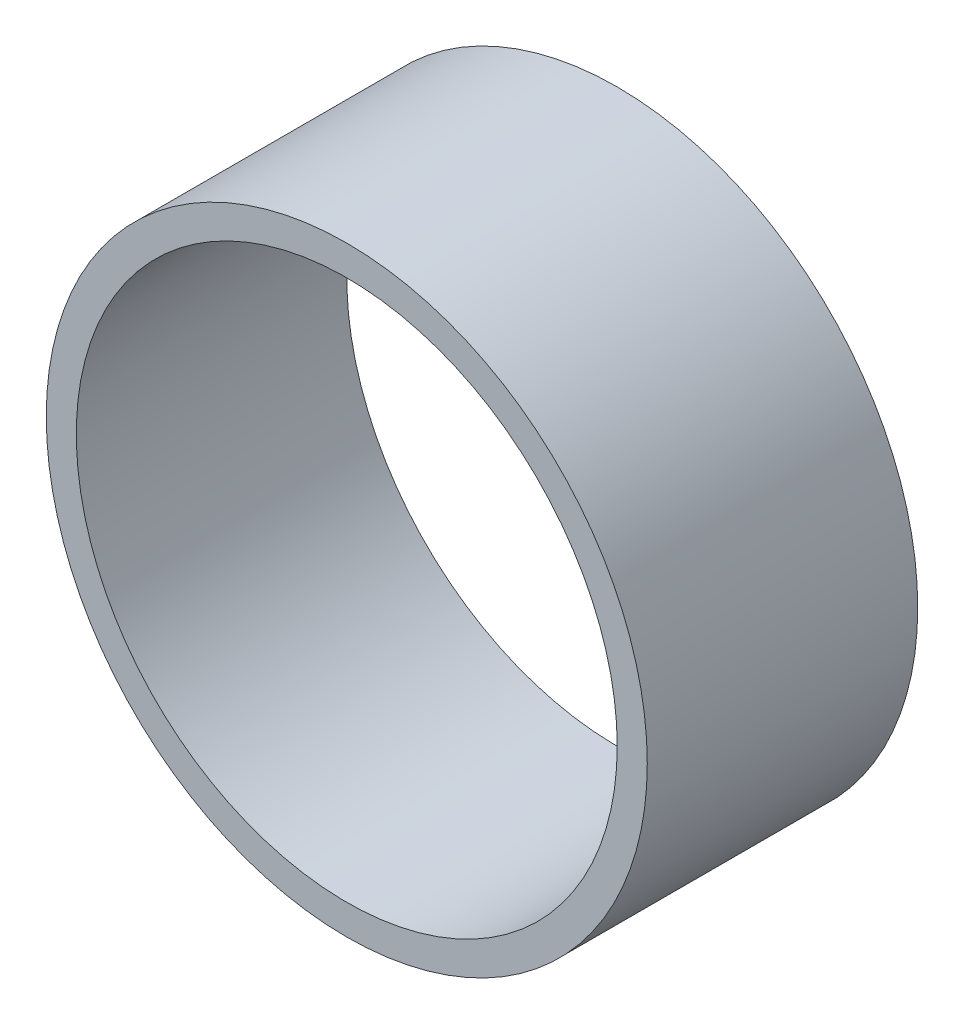
ISO-10303-21;
HEADER;
FILE_DESCRIPTION(('STEP AP214'),'2;1');
FILE_NAME('part.step','',(''),(''),'','','');
FILE_SCHEMA(('AUTOMOTIVE_DESIGN { 1 0 10303 214 1 1 1 1 }'));
ENDSEC;
DATA;
#1=APPLICATION_CONTEXT('core data for automotive mechanical design processes');
#2=APPLICATION_PROTOCOL_DEFINITION('international standard','automotive_design',2000,#1);
#3=PRODUCT_CONTEXT('',#1,'mechanical');
#4=PRODUCT('Part','Part','',(#3));
#5=PRODUCT_RELATED_PRODUCT_CATEGORY('part','',(#4));
#6=PRODUCT_DEFINITION_FORMATION('','',#4);
#7=PRODUCT_DEFINITION_CONTEXT('part definition',#1,'design');
#8=PRODUCT_DEFINITION('design','',#6,#7);
#9=PRODUCT_DEFINITION_SHAPE('','',#8);
#10=(LENGTH_UNIT() NAMED_UNIT(*) SI_UNIT(.MILLI.,.METRE.));
#11=(NAMED_UNIT(*) PLANE_ANGLE_UNIT() SI_UNIT($,.RADIAN.));
#12=(NAMED_UNIT(*) SI_UNIT($,.STERADIAN.) SOLID_ANGLE_UNIT());
#13=UNCERTAINTY_MEASURE_WITH_UNIT(LENGTH_MEASURE(1.E-05),#10,'distance_accuracy_value','');
#14=(GEOMETRIC_REPRESENTATION_CONTEXT(3) GLOBAL_UNCERTAINTY_ASSIGNED_CONTEXT((#13)) GLOBAL_UNIT_ASSIGNED_CONTEXT((#10,
#11,#12)) REPRESENTATION_CONTEXT('',''));
#15=CARTESIAN_POINT('',(0.,0.,0.));
#16=DIRECTION('',(0.,0.,1.));
#17=DIRECTION('',(1.,0.,0.));
#18=AXIS2_PLACEMENT_3D('',#15,#16,#17);
#19=CARTESIAN_POINT('',(0.,0.,9.));
#20=DIRECTION('',(0.,0.,-1.));
#21=DIRECTION('',(-1.,0.,0.));
#22=AXIS2_PLACEMENT_3D('',#19,#20,#21);
#23=CYLINDRICAL_SURFACE('',#22,10.);
#24=CARTESIAN_POINT('',(0.,0.,9.));
#25=DIRECTION('',(0.,0.,1.));
#26=DIRECTION('',(1.,0.,0.));
#27=AXIS2_PLACEMENT_3D('',#24,#25,#26);
#28=CIRCLE('',#27,10.);
#29=CARTESIAN_POINT('',(10.,0.,9.));
#30=VERTEX_POINT('',#29);
#31=EDGE_CURVE('E10',#30,#30,#28,.T.);
#32=ORIENTED_EDGE('',*,*,#31,.F.);
#33=EDGE_LOOP('',(#32));
#34=FACE_BOUND('',#33,.T.);
#35=CARTESIAN_POINT('',(0.,0.,0.));
#36=DIRECTION('',(0.,0.,1.));
#37=DIRECTION('',(1.,0.,0.));
#38=AXIS2_PLACEMENT_3D('',#35,#36,#37);
#39=CIRCLE('',#38,10.);
#40=CARTESIAN_POINT('',(10.,0.,0.));
#41=VERTEX_POINT('',#40);
#42=EDGE_CURVE('E37',#41,#41,#39,.T.);
#43=ORIENTED_EDGE('',*,*,#42,.T.);
#44=EDGE_LOOP('',(#43));
#45=FACE_BOUND('',#44,.T.);
#46=ADVANCED_FACE('F34',(#34,#45),#23,.T.);
#47=CARTESIAN_POINT('',(0.,0.,9.));
#48=DIRECTION('',(0.,0.,1.));
#49=DIRECTION('',(1.,0.,0.));
#50=AXIS2_PLACEMENT_3D('',#47,#48,#49);
#51=PLANE('',#50);
#52=CARTESIAN_POINT('',(0.,0.,9.));
#53=DIRECTION('',(0.,0.,1.));
#54=DIRECTION('',(1.,0.,0.));
#55=AXIS2_PLACEMENT_3D('',#52,#53,#54);
#56=CIRCLE('',#55,9.);
#57=CARTESIAN_POINT('',(9.,0.,9.));
#58=VERTEX_POINT('',#57);
#59=EDGE_CURVE('E46',#58,#58,#56,.T.);
#60=ORIENTED_EDGE('',*,*,#59,.F.);
#61=EDGE_LOOP('',(#60));
#62=FACE_BOUND('',#61,.T.);
#63=ORIENTED_EDGE('',*,*,#31,.T.);
#64=EDGE_LOOP('',(#63));
#65=FACE_BOUND('',#64,.T.);
#66=ADVANCED_FACE('F61',(#62,#65),#51,.T.);
#67=CARTESIAN_POINT('',(0.,0.,0.));
#68=DIRECTION('',(0.,0.,1.));
#69=DIRECTION('',(1.,0.,0.));
#70=AXIS2_PLACEMENT_3D('',#67,#68,#69);
#71=PLANE('',#70);
#72=CARTESIAN_POINT('',(0.,0.,0.));
#73=DIRECTION('',(0.,0.,1.));
#74=DIRECTION('',(1.,0.,0.));
#75=AXIS2_PLACEMENT_3D('',#72,#73,#74);
#76=CIRCLE('',#75,9.);
#77=CARTESIAN_POINT('',(9.,0.,0.));
#78=VERTEX_POINT('',#77);
#79=EDGE_CURVE('E44',#78,#78,#76,.T.);
#80=ORIENTED_EDGE('',*,*,#79,.T.);
#81=EDGE_LOOP('',(#80));
#82=FACE_BOUND('',#81,.T.);
#83=ORIENTED_EDGE('',*,*,#42,.F.);
#84=EDGE_LOOP('',(#83));
#85=FACE_BOUND('',#84,.T.);
#86=ADVANCED_FACE('F52',(#82,#85),#71,.F.);
#87=CARTESIAN_POINT('',(0.,0.,0.));
#88=DIRECTION('',(0.,0.,1.));
#89=DIRECTION('',(1.,0.,0.));
#90=AXIS2_PLACEMENT_3D('',#87,#88,#89);
#91=CYLINDRICAL_SURFACE('',#90,9.);
#92=ORIENTED_EDGE('',*,*,#79,.F.);
#93=EDGE_LOOP('',(#92));
#94=FACE_BOUND('',#93,.T.);
#95=ORIENTED_EDGE('',*,*,#59,.T.);
#96=EDGE_LOOP('',(#95));
#97=FACE_BOUND('',#96,.T.);
#98=ADVANCED_FACE('F55',(#94,#97),#91,.F.);
#99=CLOSED_SHELL('',(#46,#66,#86,#98));
#100=MANIFOLD_SOLID_BREP('B2',#99);
#101=ADVANCED_BREP_SHAPE_REPRESENTATION('',(#18,#100),#14);
#102=SHAPE_DEFINITION_REPRESENTATION(#9,#101);
ENDSEC;
END-ISO-10303-21;
